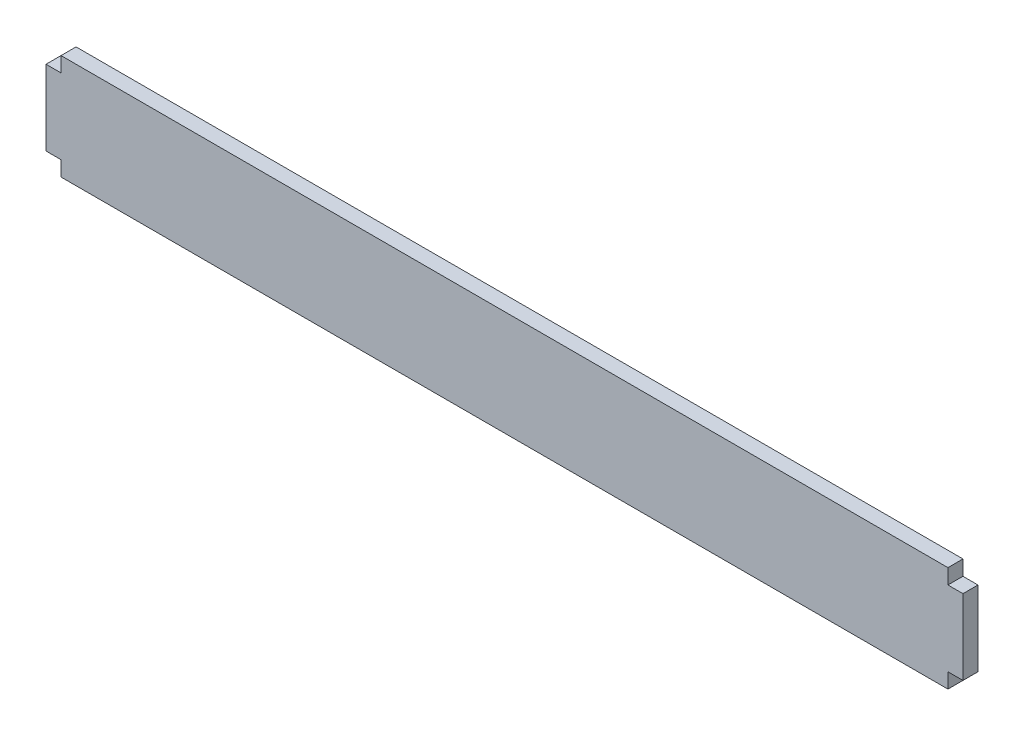
ISO-10303-21;
HEADER;
FILE_DESCRIPTION(('STEP AP214'),'2;1');
FILE_NAME('part.step','',(''),(''),'','','');
FILE_SCHEMA(('AUTOMOTIVE_DESIGN { 1 0 10303 214 1 1 1 1 }'));
ENDSEC;
DATA;
#1=APPLICATION_CONTEXT('core data for automotive mechanical design processes');
#2=APPLICATION_PROTOCOL_DEFINITION('international standard','automotive_design',2000,#1);
#3=PRODUCT_CONTEXT('',#1,'mechanical');
#4=PRODUCT('Part','Part','',(#3));
#5=PRODUCT_RELATED_PRODUCT_CATEGORY('part','',(#4));
#6=PRODUCT_DEFINITION_FORMATION('','',#4);
#7=PRODUCT_DEFINITION_CONTEXT('part definition',#1,'design');
#8=PRODUCT_DEFINITION('design','',#6,#7);
#9=PRODUCT_DEFINITION_SHAPE('','',#8);
#10=(LENGTH_UNIT() NAMED_UNIT(*) SI_UNIT(.MILLI.,.METRE.));
#11=(NAMED_UNIT(*) PLANE_ANGLE_UNIT() SI_UNIT($,.RADIAN.));
#12=(NAMED_UNIT(*) SI_UNIT($,.STERADIAN.) SOLID_ANGLE_UNIT());
#13=UNCERTAINTY_MEASURE_WITH_UNIT(LENGTH_MEASURE(1.E-05),#10,'distance_accuracy_value','');
#14=(GEOMETRIC_REPRESENTATION_CONTEXT(3) GLOBAL_UNCERTAINTY_ASSIGNED_CONTEXT((#13)) GLOBAL_UNIT_ASSIGNED_CONTEXT((#10,
#11,#12)) REPRESENTATION_CONTEXT('',''));
#15=CARTESIAN_POINT('',(0.,0.,0.));
#16=DIRECTION('',(0.,0.,1.));
#17=DIRECTION('',(1.,0.,0.));
#18=AXIS2_PLACEMENT_3D('',#15,#16,#17);
#19=CARTESIAN_POINT('',(-295.,0.,5.));
#20=DIRECTION('',(-1.,0.,0.));
#21=DIRECTION('',(0.,0.,1.));
#22=AXIS2_PLACEMENT_3D('',#19,#20,#21);
#23=PLANE('',#22);
#24=DIRECTION('',(0.,1.,0.));
#25=VECTOR('',#24,1.);
#26=CARTESIAN_POINT('',(-295.,0.,0.));
#27=LINE('',#26,#25);
#28=CARTESIAN_POINT('',(-295.,0.,0.));
#29=VERTEX_POINT('',#28);
#30=CARTESIAN_POINT('',(-295.,5.,0.));
#31=VERTEX_POINT('',#30);
#32=EDGE_CURVE('E151',#29,#31,#27,.T.);
#33=ORIENTED_EDGE('',*,*,#32,.F.);
#34=DIRECTION('',(0.,0.,-1.));
#35=VECTOR('',#34,1.);
#36=CARTESIAN_POINT('',(-295.,0.,5.));
#37=LINE('',#36,#35);
#38=CARTESIAN_POINT('',(-295.,0.,5.));
#39=VERTEX_POINT('',#38);
#40=EDGE_CURVE('E11',#39,#29,#37,.T.);
#41=ORIENTED_EDGE('',*,*,#40,.F.);
#42=DIRECTION('',(0.,1.,0.));
#43=VECTOR('',#42,1.);
#44=CARTESIAN_POINT('',(-295.,0.,5.));
#45=LINE('',#44,#43);
#46=CARTESIAN_POINT('',(-295.,5.,5.));
#47=VERTEX_POINT('',#46);
#48=EDGE_CURVE('E177',#39,#47,#45,.T.);
#49=ORIENTED_EDGE('',*,*,#48,.T.);
#50=DIRECTION('',(0.,0.,-1.));
#51=VECTOR('',#50,1.);
#52=CARTESIAN_POINT('',(-295.,5.,5.));
#53=LINE('',#52,#51);
#54=EDGE_CURVE('E51',#47,#31,#53,.T.);
#55=ORIENTED_EDGE('',*,*,#54,.T.);
#56=EDGE_LOOP('',(#33,#41,#49,#55));
#57=FACE_BOUND('',#56,.T.);
#58=ADVANCED_FACE('F34',(#57),#23,.T.);
#59=CARTESIAN_POINT('',(0.,0.,5.));
#60=DIRECTION('',(0.,-1.,0.));
#61=DIRECTION('',(0.,0.,-1.));
#62=AXIS2_PLACEMENT_3D('',#59,#60,#61);
#63=PLANE('',#62);
#64=DIRECTION('',(-1.,0.,0.));
#65=VECTOR('',#64,1.);
#66=CARTESIAN_POINT('',(0.,0.,0.));
#67=LINE('',#66,#65);
#68=CARTESIAN_POINT('',(0.,0.,0.));
#69=VERTEX_POINT('',#68);
#70=EDGE_CURVE('E153',#69,#29,#67,.T.);
#71=ORIENTED_EDGE('',*,*,#70,.F.);
#72=DIRECTION('',(0.,0.,-1.));
#73=VECTOR('',#72,1.);
#74=CARTESIAN_POINT('',(0.,0.,5.));
#75=LINE('',#74,#73);
#76=CARTESIAN_POINT('',(0.,0.,5.));
#77=VERTEX_POINT('',#76);
#78=EDGE_CURVE('E43',#77,#69,#75,.T.);
#79=ORIENTED_EDGE('',*,*,#78,.F.);
#80=DIRECTION('',(-1.,0.,0.));
#81=VECTOR('',#80,1.);
#82=CARTESIAN_POINT('',(0.,0.,5.));
#83=LINE('',#82,#81);
#84=EDGE_CURVE('E209',#77,#39,#83,.T.);
#85=ORIENTED_EDGE('',*,*,#84,.T.);
#86=ORIENTED_EDGE('',*,*,#40,.T.);
#87=EDGE_LOOP('',(#71,#79,#85,#86));
#88=FACE_BOUND('',#87,.T.);
#89=ADVANCED_FACE('F36',(#88),#63,.T.);
#90=CARTESIAN_POINT('',(0.,0.,5.));
#91=DIRECTION('',(-1.,0.,0.));
#92=DIRECTION('',(0.,-1.,0.));
#93=AXIS2_PLACEMENT_3D('',#90,#91,#92);
#94=PLANE('',#93);
#95=DIRECTION('',(0.,1.,0.));
#96=VECTOR('',#95,1.);
#97=CARTESIAN_POINT('',(0.,0.,0.));
#98=LINE('',#97,#96);
#99=CARTESIAN_POINT('',(0.,5.,0.));
#100=VERTEX_POINT('',#99);
#101=EDGE_CURVE('E157',#69,#100,#98,.T.);
#102=ORIENTED_EDGE('',*,*,#101,.T.);
#103=DIRECTION('',(0.,0.,-1.));
#104=VECTOR('',#103,1.);
#105=CARTESIAN_POINT('',(0.,5.,5.));
#106=LINE('',#105,#104);
#107=CARTESIAN_POINT('',(0.,5.,5.));
#108=VERTEX_POINT('',#107);
#109=EDGE_CURVE('E193',#108,#100,#106,.T.);
#110=ORIENTED_EDGE('',*,*,#109,.F.);
#111=DIRECTION('',(0.,1.,0.));
#112=VECTOR('',#111,1.);
#113=CARTESIAN_POINT('',(0.,0.,5.));
#114=LINE('',#113,#112);
#115=EDGE_CURVE('E200',#77,#108,#114,.T.);
#116=ORIENTED_EDGE('',*,*,#115,.F.);
#117=ORIENTED_EDGE('',*,*,#78,.T.);
#118=EDGE_LOOP('',(#102,#110,#116,#117));
#119=FACE_BOUND('',#118,.T.);
#120=ADVANCED_FACE('F198',(#119),#94,.F.);
#121=CARTESIAN_POINT('',(0.,5.,5.));
#122=DIRECTION('',(0.,1.,0.));
#123=DIRECTION('',(0.,0.,1.));
#124=AXIS2_PLACEMENT_3D('',#121,#122,#123);
#125=PLANE('',#124);
#126=DIRECTION('',(1.,0.,0.));
#127=VECTOR('',#126,1.);
#128=CARTESIAN_POINT('',(0.,5.,0.));
#129=LINE('',#128,#127);
#130=CARTESIAN_POINT('',(5.,5.,0.));
#131=VERTEX_POINT('',#130);
#132=EDGE_CURVE('E159',#100,#131,#129,.T.);
#133=ORIENTED_EDGE('',*,*,#132,.T.);
#134=DIRECTION('',(0.,0.,-1.));
#135=VECTOR('',#134,1.);
#136=CARTESIAN_POINT('',(5.,5.,5.));
#137=LINE('',#136,#135);
#138=CARTESIAN_POINT('',(5.,5.,5.));
#139=VERTEX_POINT('',#138);
#140=EDGE_CURVE('E190',#139,#131,#137,.T.);
#141=ORIENTED_EDGE('',*,*,#140,.F.);
#142=DIRECTION('',(1.,0.,0.));
#143=VECTOR('',#142,1.);
#144=CARTESIAN_POINT('',(0.,5.,5.));
#145=LINE('',#144,#143);
#146=EDGE_CURVE('E263',#108,#139,#145,.T.);
#147=ORIENTED_EDGE('',*,*,#146,.F.);
#148=ORIENTED_EDGE('',*,*,#109,.T.);
#149=EDGE_LOOP('',(#133,#141,#147,#148));
#150=FACE_BOUND('',#149,.T.);
#151=ADVANCED_FACE('F262',(#150),#125,.F.);
#152=CARTESIAN_POINT('',(5.,0.,5.));
#153=DIRECTION('',(-1.,0.,0.));
#154=DIRECTION('',(0.,0.,1.));
#155=AXIS2_PLACEMENT_3D('',#152,#153,#154);
#156=PLANE('',#155);
#157=DIRECTION('',(0.,1.,0.));
#158=VECTOR('',#157,1.);
#159=CARTESIAN_POINT('',(5.,0.,0.));
#160=LINE('',#159,#158);
#161=CARTESIAN_POINT('',(5.,30.,0.));
#162=VERTEX_POINT('',#161);
#163=EDGE_CURVE('E162',#131,#162,#160,.T.);
#164=ORIENTED_EDGE('',*,*,#163,.T.);
#165=DIRECTION('',(0.,0.,-1.));
#166=VECTOR('',#165,1.);
#167=CARTESIAN_POINT('',(5.,30.,5.));
#168=LINE('',#167,#166);
#169=CARTESIAN_POINT('',(5.,30.,5.));
#170=VERTEX_POINT('',#169);
#171=EDGE_CURVE('E188',#170,#162,#168,.T.);
#172=ORIENTED_EDGE('',*,*,#171,.F.);
#173=DIRECTION('',(0.,1.,0.));
#174=VECTOR('',#173,1.);
#175=CARTESIAN_POINT('',(5.,0.,5.));
#176=LINE('',#175,#174);
#177=EDGE_CURVE('E259',#139,#170,#176,.T.);
#178=ORIENTED_EDGE('',*,*,#177,.F.);
#179=ORIENTED_EDGE('',*,*,#140,.T.);
#180=EDGE_LOOP('',(#164,#172,#178,#179));
#181=FACE_BOUND('',#180,.T.);
#182=ADVANCED_FACE('F256',(#181),#156,.F.);
#183=CARTESIAN_POINT('',(0.,30.,5.));
#184=DIRECTION('',(0.,1.,0.));
#185=DIRECTION('',(0.,0.,1.));
#186=AXIS2_PLACEMENT_3D('',#183,#184,#185);
#187=PLANE('',#186);
#188=DIRECTION('',(1.,0.,0.));
#189=VECTOR('',#188,1.);
#190=CARTESIAN_POINT('',(0.,30.,0.));
#191=LINE('',#190,#189);
#192=CARTESIAN_POINT('',(0.,30.,0.));
#193=VERTEX_POINT('',#192);
#194=EDGE_CURVE('E165',#193,#162,#191,.T.);
#195=ORIENTED_EDGE('',*,*,#194,.F.);
#196=DIRECTION('',(0.,0.,-1.));
#197=VECTOR('',#196,1.);
#198=CARTESIAN_POINT('',(0.,30.,5.));
#199=LINE('',#198,#197);
#200=CARTESIAN_POINT('',(0.,30.,5.));
#201=VERTEX_POINT('',#200);
#202=EDGE_CURVE('E186',#201,#193,#199,.T.);
#203=ORIENTED_EDGE('',*,*,#202,.F.);
#204=DIRECTION('',(1.,0.,0.));
#205=VECTOR('',#204,1.);
#206=CARTESIAN_POINT('',(0.,30.,5.));
#207=LINE('',#206,#205);
#208=EDGE_CURVE('E253',#201,#170,#207,.T.);
#209=ORIENTED_EDGE('',*,*,#208,.T.);
#210=ORIENTED_EDGE('',*,*,#171,.T.);
#211=EDGE_LOOP('',(#195,#203,#209,#210));
#212=FACE_BOUND('',#211,.T.);
#213=ADVANCED_FACE('F252',(#212),#187,.T.);
#214=CARTESIAN_POINT('',(0.,35.0000000000001,0.));
#215=VERTEX_POINT('',#214);
#216=EDGE_CURVE('E160',#193,#215,#98,.T.);
#217=ORIENTED_EDGE('',*,*,#216,.T.);
#218=DIRECTION('',(0.,0.,-1.));
#219=VECTOR('',#218,1.);
#220=CARTESIAN_POINT('',(0.,35.0000000000001,5.));
#221=LINE('',#220,#219);
#222=CARTESIAN_POINT('',(0.,35.0000000000001,5.));
#223=VERTEX_POINT('',#222);
#224=EDGE_CURVE('E183',#223,#215,#221,.T.);
#225=ORIENTED_EDGE('',*,*,#224,.F.);
#226=EDGE_CURVE('E248',#201,#223,#114,.T.);
#227=ORIENTED_EDGE('',*,*,#226,.F.);
#228=ORIENTED_EDGE('',*,*,#202,.T.);
#229=EDGE_LOOP('',(#217,#225,#227,#228));
#230=FACE_BOUND('',#229,.T.);
#231=ADVANCED_FACE('F235',(#230),#94,.F.);
#232=CARTESIAN_POINT('',(0.,35.0000000000001,5.));
#233=DIRECTION('',(0.,-1.,0.));
#234=DIRECTION('',(1.,0.,0.));
#235=AXIS2_PLACEMENT_3D('',#232,#233,#234);
#236=PLANE('',#235);
#237=DIRECTION('',(-1.,0.,0.));
#238=VECTOR('',#237,1.);
#239=CARTESIAN_POINT('',(0.,35.0000000000001,0.));
#240=LINE('',#239,#238);
#241=CARTESIAN_POINT('',(-295.,35.,0.));
#242=VERTEX_POINT('',#241);
#243=EDGE_CURVE('E168',#215,#242,#240,.T.);
#244=ORIENTED_EDGE('',*,*,#243,.T.);
#245=DIRECTION('',(0.,0.,-1.));
#246=VECTOR('',#245,1.);
#247=CARTESIAN_POINT('',(-295.,35.,5.));
#248=LINE('',#247,#246);
#249=CARTESIAN_POINT('',(-295.,35.,5.));
#250=VERTEX_POINT('',#249);
#251=EDGE_CURVE('E181',#250,#242,#248,.T.);
#252=ORIENTED_EDGE('',*,*,#251,.F.);
#253=DIRECTION('',(-1.,0.,0.));
#254=VECTOR('',#253,1.);
#255=CARTESIAN_POINT('',(0.,35.0000000000001,5.));
#256=LINE('',#255,#254);
#257=EDGE_CURVE('E245',#223,#250,#256,.T.);
#258=ORIENTED_EDGE('',*,*,#257,.F.);
#259=ORIENTED_EDGE('',*,*,#224,.T.);
#260=EDGE_LOOP('',(#244,#252,#258,#259));
#261=FACE_BOUND('',#260,.T.);
#262=ADVANCED_FACE('F229',(#261),#236,.F.);
#263=CARTESIAN_POINT('',(-295.,30.,0.));
#264=VERTEX_POINT('',#263);
#265=EDGE_CURVE('E154',#264,#242,#27,.T.);
#266=ORIENTED_EDGE('',*,*,#265,.F.);
#267=DIRECTION('',(0.,0.,-1.));
#268=VECTOR('',#267,1.);
#269=CARTESIAN_POINT('',(-295.,30.,5.));
#270=LINE('',#269,#268);
#271=CARTESIAN_POINT('',(-295.,30.,5.));
#272=VERTEX_POINT('',#271);
#273=EDGE_CURVE('E143',#272,#264,#270,.T.);
#274=ORIENTED_EDGE('',*,*,#273,.F.);
#275=EDGE_CURVE('E133',#272,#250,#45,.T.);
#276=ORIENTED_EDGE('',*,*,#275,.T.);
#277=ORIENTED_EDGE('',*,*,#251,.T.);
#278=EDGE_LOOP('',(#266,#274,#276,#277));
#279=FACE_BOUND('',#278,.T.);
#280=ADVANCED_FACE('F222',(#279),#23,.T.);
#281=CARTESIAN_POINT('',(0.,30.,5.));
#282=DIRECTION('',(0.,-1.,0.));
#283=DIRECTION('',(0.,0.,-1.));
#284=AXIS2_PLACEMENT_3D('',#281,#282,#283);
#285=PLANE('',#284);
#286=DIRECTION('',(-1.,0.,0.));
#287=VECTOR('',#286,1.);
#288=CARTESIAN_POINT('',(0.,30.,0.));
#289=LINE('',#288,#287);
#290=CARTESIAN_POINT('',(-300.,30.,0.));
#291=VERTEX_POINT('',#290);
#292=EDGE_CURVE('E140',#264,#291,#289,.T.);
#293=ORIENTED_EDGE('',*,*,#292,.T.);
#294=DIRECTION('',(0.,0.,-1.));
#295=VECTOR('',#294,1.);
#296=CARTESIAN_POINT('',(-300.,30.,5.));
#297=LINE('',#296,#295);
#298=CARTESIAN_POINT('',(-300.,30.,5.));
#299=VERTEX_POINT('',#298);
#300=EDGE_CURVE('E137',#299,#291,#297,.T.);
#301=ORIENTED_EDGE('',*,*,#300,.F.);
#302=DIRECTION('',(-1.,0.,0.));
#303=VECTOR('',#302,1.);
#304=CARTESIAN_POINT('',(0.,30.,5.));
#305=LINE('',#304,#303);
#306=EDGE_CURVE('E126',#272,#299,#305,.T.);
#307=ORIENTED_EDGE('',*,*,#306,.F.);
#308=ORIENTED_EDGE('',*,*,#273,.T.);
#309=EDGE_LOOP('',(#293,#301,#307,#308));
#310=FACE_BOUND('',#309,.T.);
#311=ADVANCED_FACE('F138',(#310),#285,.F.);
#312=CARTESIAN_POINT('',(-300.,0.,5.));
#313=DIRECTION('',(-1.,0.,0.));
#314=DIRECTION('',(0.,0.,1.));
#315=AXIS2_PLACEMENT_3D('',#312,#313,#314);
#316=PLANE('',#315);
#317=DIRECTION('',(0.,1.,0.));
#318=VECTOR('',#317,1.);
#319=CARTESIAN_POINT('',(-300.,0.,0.));
#320=LINE('',#319,#318);
#321=CARTESIAN_POINT('',(-300.,5.,0.));
#322=VERTEX_POINT('',#321);
#323=EDGE_CURVE('E172',#322,#291,#320,.T.);
#324=ORIENTED_EDGE('',*,*,#323,.F.);
#325=DIRECTION('',(0.,0.,-1.));
#326=VECTOR('',#325,1.);
#327=CARTESIAN_POINT('',(-300.,5.,5.));
#328=LINE('',#327,#326);
#329=CARTESIAN_POINT('',(-300.,5.,5.));
#330=VERTEX_POINT('',#329);
#331=EDGE_CURVE('E88',#330,#322,#328,.T.);
#332=ORIENTED_EDGE('',*,*,#331,.F.);
#333=DIRECTION('',(0.,1.,0.));
#334=VECTOR('',#333,1.);
#335=CARTESIAN_POINT('',(-300.,0.,5.));
#336=LINE('',#335,#334);
#337=EDGE_CURVE('E131',#330,#299,#336,.T.);
#338=ORIENTED_EDGE('',*,*,#337,.T.);
#339=ORIENTED_EDGE('',*,*,#300,.T.);
#340=EDGE_LOOP('',(#324,#332,#338,#339));
#341=FACE_BOUND('',#340,.T.);
#342=ADVANCED_FACE('F145',(#341),#316,.T.);
#343=CARTESIAN_POINT('',(0.,5.,5.));
#344=DIRECTION('',(0.,-1.,0.));
#345=DIRECTION('',(0.,0.,-1.));
#346=AXIS2_PLACEMENT_3D('',#343,#344,#345);
#347=PLANE('',#346);
#348=DIRECTION('',(-1.,0.,0.));
#349=VECTOR('',#348,1.);
#350=CARTESIAN_POINT('',(0.,5.,0.));
#351=LINE('',#350,#349);
#352=EDGE_CURVE('E174',#31,#322,#351,.T.);
#353=ORIENTED_EDGE('',*,*,#352,.F.);
#354=ORIENTED_EDGE('',*,*,#54,.F.);
#355=DIRECTION('',(-1.,0.,0.));
#356=VECTOR('',#355,1.);
#357=CARTESIAN_POINT('',(0.,5.,5.));
#358=LINE('',#357,#356);
#359=EDGE_CURVE('E146',#47,#330,#358,.T.);
#360=ORIENTED_EDGE('',*,*,#359,.T.);
#361=ORIENTED_EDGE('',*,*,#331,.T.);
#362=EDGE_LOOP('',(#353,#354,#360,#361));
#363=FACE_BOUND('',#362,.T.);
#364=ADVANCED_FACE('F210',(#363),#347,.T.);
#365=CARTESIAN_POINT('',(0.,0.,5.));
#366=DIRECTION('',(0.,0.,1.));
#367=DIRECTION('',(1.,0.,0.));
#368=AXIS2_PLACEMENT_3D('',#365,#366,#367);
#369=PLANE('',#368);
#370=ORIENTED_EDGE('',*,*,#48,.F.);
#371=ORIENTED_EDGE('',*,*,#84,.F.);
#372=ORIENTED_EDGE('',*,*,#115,.T.);
#373=ORIENTED_EDGE('',*,*,#146,.T.);
#374=ORIENTED_EDGE('',*,*,#177,.T.);
#375=ORIENTED_EDGE('',*,*,#208,.F.);
#376=ORIENTED_EDGE('',*,*,#226,.T.);
#377=ORIENTED_EDGE('',*,*,#257,.T.);
#378=ORIENTED_EDGE('',*,*,#275,.F.);
#379=ORIENTED_EDGE('',*,*,#306,.T.);
#380=ORIENTED_EDGE('',*,*,#337,.F.);
#381=ORIENTED_EDGE('',*,*,#359,.F.);
#382=EDGE_LOOP('',(#370,#371,#372,#373,#374,#375,#376,#377,#378,#379,#380,#381));
#383=FACE_BOUND('',#382,.T.);
#384=ADVANCED_FACE('F128',(#383),#369,.T.);
#385=CARTESIAN_POINT('',(0.,0.,0.));
#386=DIRECTION('',(0.,0.,1.));
#387=DIRECTION('',(1.,0.,0.));
#388=AXIS2_PLACEMENT_3D('',#385,#386,#387);
#389=PLANE('',#388);
#390=ORIENTED_EDGE('',*,*,#32,.T.);
#391=ORIENTED_EDGE('',*,*,#352,.T.);
#392=ORIENTED_EDGE('',*,*,#323,.T.);
#393=ORIENTED_EDGE('',*,*,#292,.F.);
#394=ORIENTED_EDGE('',*,*,#265,.T.);
#395=ORIENTED_EDGE('',*,*,#243,.F.);
#396=ORIENTED_EDGE('',*,*,#216,.F.);
#397=ORIENTED_EDGE('',*,*,#194,.T.);
#398=ORIENTED_EDGE('',*,*,#163,.F.);
#399=ORIENTED_EDGE('',*,*,#132,.F.);
#400=ORIENTED_EDGE('',*,*,#101,.F.);
#401=ORIENTED_EDGE('',*,*,#70,.T.);
#402=EDGE_LOOP('',(#390,#391,#392,#393,#394,#395,#396,#397,#398,#399,#400,#401));
#403=FACE_BOUND('',#402,.T.);
#404=ADVANCED_FACE('F207',(#403),#389,.F.);
#405=CLOSED_SHELL('',(#58,#89,#120,#151,#182,#213,#231,#262,#280,#311,#342,#364,#384,#404));
#406=MANIFOLD_SOLID_BREP('B2',#405);
#407=ADVANCED_BREP_SHAPE_REPRESENTATION('',(#18,#406),#14);
#408=SHAPE_DEFINITION_REPRESENTATION(#9,#407);
ENDSEC;
END-ISO-10303-21;
